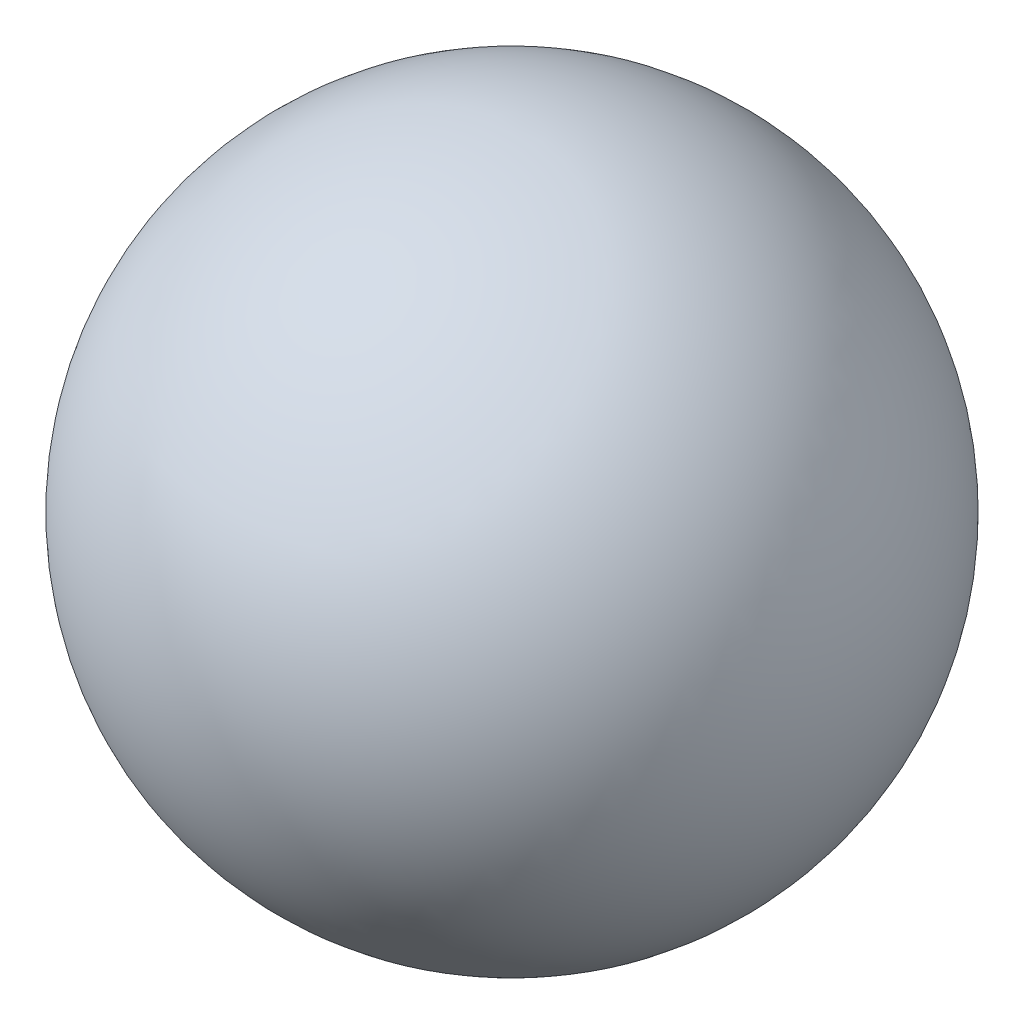
ISO-10303-21;
HEADER;
FILE_DESCRIPTION(('STEP AP214'),'2;1');
FILE_NAME('part.step','',(''),(''),'','','');
FILE_SCHEMA(('AUTOMOTIVE_DESIGN { 1 0 10303 214 1 1 1 1 }'));
ENDSEC;
DATA;
#1=APPLICATION_CONTEXT('core data for automotive mechanical design processes');
#2=APPLICATION_PROTOCOL_DEFINITION('international standard','automotive_design',2000,#1);
#3=PRODUCT_CONTEXT('',#1,'mechanical');
#4=PRODUCT('Part','Part','',(#3));
#5=PRODUCT_RELATED_PRODUCT_CATEGORY('part','',(#4));
#6=PRODUCT_DEFINITION_FORMATION('','',#4);
#7=PRODUCT_DEFINITION_CONTEXT('part definition',#1,'design');
#8=PRODUCT_DEFINITION('design','',#6,#7);
#9=PRODUCT_DEFINITION_SHAPE('','',#8);
#10=(LENGTH_UNIT() NAMED_UNIT(*) SI_UNIT(.MILLI.,.METRE.));
#11=(NAMED_UNIT(*) PLANE_ANGLE_UNIT() SI_UNIT($,.RADIAN.));
#12=(NAMED_UNIT(*) SI_UNIT($,.STERADIAN.) SOLID_ANGLE_UNIT());
#13=UNCERTAINTY_MEASURE_WITH_UNIT(LENGTH_MEASURE(1.E-05),#10,'distance_accuracy_value','');
#14=(GEOMETRIC_REPRESENTATION_CONTEXT(3) GLOBAL_UNCERTAINTY_ASSIGNED_CONTEXT((#13)) GLOBAL_UNIT_ASSIGNED_CONTEXT((#10,
#11,#12)) REPRESENTATION_CONTEXT('',''));
#15=CARTESIAN_POINT('',(0.,0.,0.));
#16=DIRECTION('',(0.,0.,1.));
#17=DIRECTION('',(1.,0.,0.));
#18=AXIS2_PLACEMENT_3D('',#15,#16,#17);
#19=CARTESIAN_POINT('',(0.,300.,0.));
#20=DIRECTION('',(0.,-1.,0.));
#21=DIRECTION('',(-1.,0.,0.));
#22=AXIS2_PLACEMENT_3D('',#19,#20,#21);
#23=SPHERICAL_SURFACE('',#22,300.);
#24=CARTESIAN_POINT('',(0.,0.,0.));
#25=VERTEX_POINT('',#24);
#26=VERTEX_LOOP('',#25);
#27=FACE_BOUND('',#26,.T.);
#28=ADVANCED_FACE('F31',(#27),#23,.T.);
#29=CLOSED_SHELL('',(#28));
#30=MANIFOLD_SOLID_BREP('B2',#29);
#31=ADVANCED_BREP_SHAPE_REPRESENTATION('',(#18,#30),#14);
#32=SHAPE_DEFINITION_REPRESENTATION(#9,#31);
ENDSEC;
END-ISO-10303-21;
